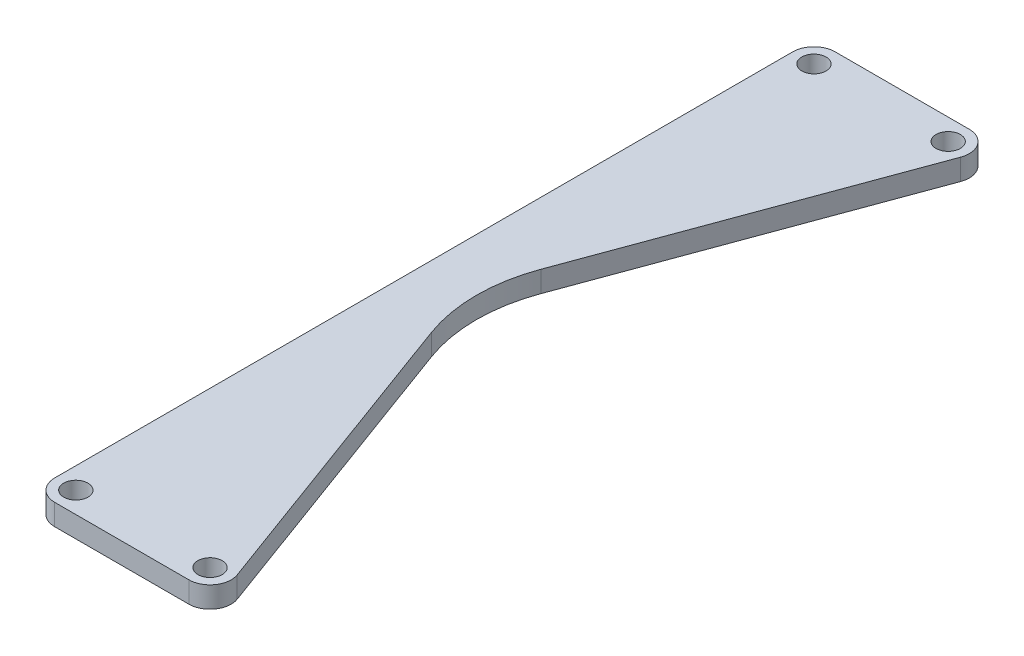
ISO-10303-21;
HEADER;
FILE_DESCRIPTION(('STEP AP214'),'2;1');
FILE_NAME('part.step','',(''),(''),'','','');
FILE_SCHEMA(('AUTOMOTIVE_DESIGN { 1 0 10303 214 1 1 1 1 }'));
ENDSEC;
DATA;
#1=APPLICATION_CONTEXT('core data for automotive mechanical design processes');
#2=APPLICATION_PROTOCOL_DEFINITION('international standard','automotive_design',2000,#1);
#3=PRODUCT_CONTEXT('',#1,'mechanical');
#4=PRODUCT('Part','Part','',(#3));
#5=PRODUCT_RELATED_PRODUCT_CATEGORY('part','',(#4));
#6=PRODUCT_DEFINITION_FORMATION('','',#4);
#7=PRODUCT_DEFINITION_CONTEXT('part definition',#1,'design');
#8=PRODUCT_DEFINITION('design','',#6,#7);
#9=PRODUCT_DEFINITION_SHAPE('','',#8);
#10=(LENGTH_UNIT() NAMED_UNIT(*) SI_UNIT(.MILLI.,.METRE.));
#11=(NAMED_UNIT(*) PLANE_ANGLE_UNIT() SI_UNIT($,.RADIAN.));
#12=(NAMED_UNIT(*) SI_UNIT($,.STERADIAN.) SOLID_ANGLE_UNIT());
#13=UNCERTAINTY_MEASURE_WITH_UNIT(LENGTH_MEASURE(1.E-05),#10,'distance_accuracy_value','');
#14=(GEOMETRIC_REPRESENTATION_CONTEXT(3) GLOBAL_UNCERTAINTY_ASSIGNED_CONTEXT((#13)) GLOBAL_UNIT_ASSIGNED_CONTEXT((#10,
#11,#12)) REPRESENTATION_CONTEXT('',''));
#15=CARTESIAN_POINT('',(0.,0.,0.));
#16=DIRECTION('',(0.,0.,1.));
#17=DIRECTION('',(1.,0.,0.));
#18=AXIS2_PLACEMENT_3D('',#15,#16,#17);
#19=CARTESIAN_POINT('',(25.4,4.,139.7));
#20=DIRECTION('',(0.,1.,0.));
#21=DIRECTION('',(0.,0.,1.));
#22=AXIS2_PLACEMENT_3D('',#19,#20,#21);
#23=PLANE('',#22);
#24=CARTESIAN_POINT('',(25.4,4.,139.7));
#25=DIRECTION('',(0.,1.,0.));
#26=DIRECTION('',(0.,0.,1.));
#27=AXIS2_PLACEMENT_3D('',#24,#25,#26);
#28=CIRCLE('',#27,2.3);
#29=CARTESIAN_POINT('',(25.4,4.,142.));
#30=VERTEX_POINT('',#29);
#31=EDGE_CURVE('E267',#30,#30,#28,.T.);
#32=ORIENTED_EDGE('',*,*,#31,.F.);
#33=EDGE_LOOP('',(#32));
#34=FACE_BOUND('',#33,.T.);
#35=CARTESIAN_POINT('',(0.,4.,0.));
#36=DIRECTION('',(0.,1.,0.));
#37=DIRECTION('',(0.,0.,1.));
#38=AXIS2_PLACEMENT_3D('',#35,#36,#37);
#39=CIRCLE('',#38,2.3);
#40=CARTESIAN_POINT('',(0.,4.,2.3));
#41=VERTEX_POINT('',#40);
#42=EDGE_CURVE('E163',#41,#41,#39,.T.);
#43=ORIENTED_EDGE('',*,*,#42,.F.);
#44=EDGE_LOOP('',(#43));
#45=FACE_BOUND('',#44,.T.);
#46=DIRECTION('',(-1.,0.,0.));
#47=VECTOR('',#46,1.);
#48=CARTESIAN_POINT('',(-4.00000000000002,4.,-4.));
#49=LINE('',#48,#47);
#50=CARTESIAN_POINT('',(25.4,4.,-4.));
#51=VERTEX_POINT('',#50);
#52=CARTESIAN_POINT('',(0.,4.,-4.));
#53=VERTEX_POINT('',#52);
#54=EDGE_CURVE('E143',#51,#53,#49,.T.);
#55=ORIENTED_EDGE('',*,*,#54,.T.);
#56=CARTESIAN_POINT('',(0.,4.,0.));
#57=DIRECTION('',(0.,1.,0.));
#58=DIRECTION('',(0.,0.,1.));
#59=AXIS2_PLACEMENT_3D('',#56,#57,#58);
#60=CIRCLE('',#59,4.);
#61=CARTESIAN_POINT('',(-4.00000000000002,4.,0.));
#62=VERTEX_POINT('',#61);
#63=EDGE_CURVE('E210',#53,#62,#60,.T.);
#64=ORIENTED_EDGE('',*,*,#63,.T.);
#65=DIRECTION('',(0.,0.,1.));
#66=VECTOR('',#65,1.);
#67=CARTESIAN_POINT('',(-3.99999999999999,4.,143.7));
#68=LINE('',#67,#66);
#69=CARTESIAN_POINT('',(-3.99999999999999,4.,139.7));
#70=VERTEX_POINT('',#69);
#71=EDGE_CURVE('E146',#62,#70,#68,.T.);
#72=ORIENTED_EDGE('',*,*,#71,.T.);
#73=CARTESIAN_POINT('',(0.,4.,139.7));
#74=DIRECTION('',(0.,1.,0.));
#75=DIRECTION('',(0.,0.,1.));
#76=AXIS2_PLACEMENT_3D('',#73,#74,#75);
#77=CIRCLE('',#76,4.);
#78=CARTESIAN_POINT('',(0.,4.,143.7));
#79=VERTEX_POINT('',#78);
#80=EDGE_CURVE('E207',#70,#79,#77,.T.);
#81=ORIENTED_EDGE('',*,*,#80,.T.);
#82=DIRECTION('',(1.,0.,0.));
#83=VECTOR('',#82,1.);
#84=CARTESIAN_POINT('',(-3.99999999999999,4.,143.7));
#85=LINE('',#84,#83);
#86=CARTESIAN_POINT('',(25.4,4.,143.7));
#87=VERTEX_POINT('',#86);
#88=EDGE_CURVE('E153',#79,#87,#85,.T.);
#89=ORIENTED_EDGE('',*,*,#88,.T.);
#90=CARTESIAN_POINT('',(25.4,4.,139.7));
#91=DIRECTION('',(0.,1.,0.));
#92=DIRECTION('',(0.,0.,1.));
#93=AXIS2_PLACEMENT_3D('',#90,#91,#92);
#94=CIRCLE('',#93,4.00000000000001);
#95=CARTESIAN_POINT('',(29.154640594373,4.,138.320625501509));
#96=VERTEX_POINT('',#95);
#97=EDGE_CURVE('E156',#87,#96,#94,.T.);
#98=ORIENTED_EDGE('',*,*,#97,.T.);
#99=DIRECTION('',(-0.344843624622696,0.,-0.938660148593239));
#100=VECTOR('',#99,1.);
#101=CARTESIAN_POINT('',(4.00000000000001,4.,69.85));
#102=LINE('',#101,#100);
#103=CARTESIAN_POINT('',(7.80064474733925,4.,80.1953087386809));
#104=VERTEX_POINT('',#103);
#105=EDGE_CURVE('E127',#96,#104,#102,.T.);
#106=ORIENTED_EDGE('',*,*,#105,.T.);
#107=CARTESIAN_POINT('',(35.9604492051364,4.,69.85));
#108=DIRECTION('',(0.,1.,0.));
#109=DIRECTION('',(0.,0.,1.));
#110=AXIS2_PLACEMENT_3D('',#107,#108,#109);
#111=CIRCLE('',#110,30.);
#112=CARTESIAN_POINT('',(7.80064474733925,4.,59.5046912613191));
#113=VERTEX_POINT('',#112);
#114=EDGE_CURVE('E11',#104,#113,#111,.F.);
#115=ORIENTED_EDGE('',*,*,#114,.T.);
#116=DIRECTION('',(0.344843624622696,0.,-0.938660148593239));
#117=VECTOR('',#116,1.);
#118=CARTESIAN_POINT('',(4.00000000000001,4.,69.85));
#119=LINE('',#118,#117);
#120=CARTESIAN_POINT('',(29.154640594373,4.,1.37937449849078));
#121=VERTEX_POINT('',#120);
#122=EDGE_CURVE('E115',#113,#121,#119,.T.);
#123=ORIENTED_EDGE('',*,*,#122,.T.);
#124=CARTESIAN_POINT('',(25.4,4.,0.));
#125=DIRECTION('',(0.,1.,0.));
#126=DIRECTION('',(0.,0.,1.));
#127=AXIS2_PLACEMENT_3D('',#124,#125,#126);
#128=CIRCLE('',#127,4.);
#129=EDGE_CURVE('E120',#121,#51,#128,.T.);
#130=ORIENTED_EDGE('',*,*,#129,.T.);
#131=EDGE_LOOP('',(#55,#64,#72,#81,#89,#98,#106,#115,#123,#130));
#132=FACE_BOUND('',#131,.T.);
#133=CARTESIAN_POINT('',(25.4,4.,0.));
#134=DIRECTION('',(0.,1.,0.));
#135=DIRECTION('',(0.,0.,1.));
#136=AXIS2_PLACEMENT_3D('',#133,#134,#135);
#137=CIRCLE('',#136,2.3);
#138=CARTESIAN_POINT('',(25.4,4.,2.3));
#139=VERTEX_POINT('',#138);
#140=EDGE_CURVE('E259',#139,#139,#137,.T.);
#141=ORIENTED_EDGE('',*,*,#140,.F.);
#142=EDGE_LOOP('',(#141));
#143=FACE_BOUND('',#142,.T.);
#144=CARTESIAN_POINT('',(0.,4.,139.7));
#145=DIRECTION('',(0.,1.,0.));
#146=DIRECTION('',(0.,0.,1.));
#147=AXIS2_PLACEMENT_3D('',#144,#145,#146);
#148=CIRCLE('',#147,2.30000000000137);
#149=CARTESIAN_POINT('',(0.,4.,142.000000000001));
#150=VERTEX_POINT('',#149);
#151=EDGE_CURVE('E275',#150,#150,#148,.T.);
#152=ORIENTED_EDGE('',*,*,#151,.F.);
#153=EDGE_LOOP('',(#152));
#154=FACE_BOUND('',#153,.T.);
#155=ADVANCED_FACE('F38',(#34,#45,#132,#143,#154),#23,.T.);
#156=CARTESIAN_POINT('',(25.4,0.,139.7));
#157=DIRECTION('',(0.,1.,0.));
#158=DIRECTION('',(0.,0.,1.));
#159=AXIS2_PLACEMENT_3D('',#156,#157,#158);
#160=PLANE('',#159);
#161=DIRECTION('',(0.,0.,1.));
#162=VECTOR('',#161,1.);
#163=CARTESIAN_POINT('',(-3.99999999999999,0.,143.7));
#164=LINE('',#163,#162);
#165=CARTESIAN_POINT('',(-4.00000000000002,0.,0.));
#166=VERTEX_POINT('',#165);
#167=CARTESIAN_POINT('',(-3.99999999999999,0.,139.7));
#168=VERTEX_POINT('',#167);
#169=EDGE_CURVE('E173',#166,#168,#164,.T.);
#170=ORIENTED_EDGE('',*,*,#169,.F.);
#171=CARTESIAN_POINT('',(0.,0.,0.));
#172=DIRECTION('',(0.,1.,0.));
#173=DIRECTION('',(0.,0.,1.));
#174=AXIS2_PLACEMENT_3D('',#171,#172,#173);
#175=CIRCLE('',#174,4.);
#176=CARTESIAN_POINT('',(0.,0.,-4.));
#177=VERTEX_POINT('',#176);
#178=EDGE_CURVE('E201',#166,#177,#175,.F.);
#179=ORIENTED_EDGE('',*,*,#178,.T.);
#180=DIRECTION('',(-1.,0.,0.));
#181=VECTOR('',#180,1.);
#182=CARTESIAN_POINT('',(-4.00000000000002,0.,-4.));
#183=LINE('',#182,#181);
#184=CARTESIAN_POINT('',(25.4,0.,-4.));
#185=VERTEX_POINT('',#184);
#186=EDGE_CURVE('E169',#185,#177,#183,.T.);
#187=ORIENTED_EDGE('',*,*,#186,.F.);
#188=CARTESIAN_POINT('',(25.4,0.,0.));
#189=DIRECTION('',(0.,1.,0.));
#190=DIRECTION('',(0.,0.,1.));
#191=AXIS2_PLACEMENT_3D('',#188,#189,#190);
#192=CIRCLE('',#191,4.);
#193=CARTESIAN_POINT('',(29.154640594373,0.,1.37937449849078));
#194=VERTEX_POINT('',#193);
#195=EDGE_CURVE('E166',#194,#185,#192,.T.);
#196=ORIENTED_EDGE('',*,*,#195,.F.);
#197=DIRECTION('',(0.344843624622696,0.,-0.938660148593239));
#198=VECTOR('',#197,1.);
#199=CARTESIAN_POINT('',(4.00000000000001,0.,69.85));
#200=LINE('',#199,#198);
#201=CARTESIAN_POINT('',(7.80064474733925,0.,59.5046912613191));
#202=VERTEX_POINT('',#201);
#203=EDGE_CURVE('E132',#202,#194,#200,.T.);
#204=ORIENTED_EDGE('',*,*,#203,.F.);
#205=CARTESIAN_POINT('',(35.9604492051364,0.,69.85));
#206=DIRECTION('',(0.,1.,0.));
#207=DIRECTION('',(0.,0.,1.));
#208=AXIS2_PLACEMENT_3D('',#205,#206,#207);
#209=CIRCLE('',#208,30.);
#210=CARTESIAN_POINT('',(7.80064474733925,0.,80.1953087386809));
#211=VERTEX_POINT('',#210);
#212=EDGE_CURVE('E47',#202,#211,#209,.T.);
#213=ORIENTED_EDGE('',*,*,#212,.T.);
#214=DIRECTION('',(-0.344843624622696,0.,-0.938660148593239));
#215=VECTOR('',#214,1.);
#216=CARTESIAN_POINT('',(4.00000000000001,0.,69.85));
#217=LINE('',#216,#215);
#218=CARTESIAN_POINT('',(29.154640594373,0.,138.320625501509));
#219=VERTEX_POINT('',#218);
#220=EDGE_CURVE('E160',#219,#211,#217,.T.);
#221=ORIENTED_EDGE('',*,*,#220,.F.);
#222=CARTESIAN_POINT('',(25.4,0.,139.7));
#223=DIRECTION('',(0.,1.,0.));
#224=DIRECTION('',(0.,0.,1.));
#225=AXIS2_PLACEMENT_3D('',#222,#223,#224);
#226=CIRCLE('',#225,4.00000000000001);
#227=CARTESIAN_POINT('',(25.4,0.,143.7));
#228=VERTEX_POINT('',#227);
#229=EDGE_CURVE('E180',#228,#219,#226,.T.);
#230=ORIENTED_EDGE('',*,*,#229,.F.);
#231=DIRECTION('',(1.,0.,0.));
#232=VECTOR('',#231,1.);
#233=CARTESIAN_POINT('',(-3.99999999999999,0.,143.7));
#234=LINE('',#233,#232);
#235=CARTESIAN_POINT('',(0.,0.,143.7));
#236=VERTEX_POINT('',#235);
#237=EDGE_CURVE('E177',#236,#228,#234,.T.);
#238=ORIENTED_EDGE('',*,*,#237,.F.);
#239=CARTESIAN_POINT('',(0.,0.,139.7));
#240=DIRECTION('',(0.,1.,0.));
#241=DIRECTION('',(0.,0.,1.));
#242=AXIS2_PLACEMENT_3D('',#239,#240,#241);
#243=CIRCLE('',#242,4.);
#244=EDGE_CURVE('E198',#236,#168,#243,.F.);
#245=ORIENTED_EDGE('',*,*,#244,.T.);
#246=EDGE_LOOP('',(#170,#179,#187,#196,#204,#213,#221,#230,#238,#245));
#247=FACE_BOUND('',#246,.T.);
#248=CARTESIAN_POINT('',(0.,0.,0.));
#249=DIRECTION('',(0.,1.,0.));
#250=DIRECTION('',(0.,0.,1.));
#251=AXIS2_PLACEMENT_3D('',#248,#249,#250);
#252=CIRCLE('',#251,2.3);
#253=CARTESIAN_POINT('',(0.,0.,2.3));
#254=VERTEX_POINT('',#253);
#255=EDGE_CURVE('E255',#254,#254,#252,.T.);
#256=ORIENTED_EDGE('',*,*,#255,.T.);
#257=EDGE_LOOP('',(#256));
#258=FACE_BOUND('',#257,.T.);
#259=CARTESIAN_POINT('',(25.4,0.,0.));
#260=DIRECTION('',(0.,1.,0.));
#261=DIRECTION('',(0.,0.,1.));
#262=AXIS2_PLACEMENT_3D('',#259,#260,#261);
#263=CIRCLE('',#262,2.3);
#264=CARTESIAN_POINT('',(25.4,0.,2.3));
#265=VERTEX_POINT('',#264);
#266=EDGE_CURVE('E263',#265,#265,#263,.T.);
#267=ORIENTED_EDGE('',*,*,#266,.T.);
#268=EDGE_LOOP('',(#267));
#269=FACE_BOUND('',#268,.T.);
#270=CARTESIAN_POINT('',(25.4,0.,139.7));
#271=DIRECTION('',(0.,1.,0.));
#272=DIRECTION('',(0.,0.,1.));
#273=AXIS2_PLACEMENT_3D('',#270,#271,#272);
#274=CIRCLE('',#273,2.3);
#275=CARTESIAN_POINT('',(25.4,0.,142.));
#276=VERTEX_POINT('',#275);
#277=EDGE_CURVE('E271',#276,#276,#274,.T.);
#278=ORIENTED_EDGE('',*,*,#277,.T.);
#279=EDGE_LOOP('',(#278));
#280=FACE_BOUND('',#279,.T.);
#281=CARTESIAN_POINT('',(0.,0.,139.7));
#282=DIRECTION('',(0.,1.,0.));
#283=DIRECTION('',(0.,0.,1.));
#284=AXIS2_PLACEMENT_3D('',#281,#282,#283);
#285=CIRCLE('',#284,2.30000000000137);
#286=CARTESIAN_POINT('',(0.,0.,142.000000000001));
#287=VERTEX_POINT('',#286);
#288=EDGE_CURVE('E279',#287,#287,#285,.T.);
#289=ORIENTED_EDGE('',*,*,#288,.T.);
#290=EDGE_LOOP('',(#289));
#291=FACE_BOUND('',#290,.T.);
#292=ADVANCED_FACE('F224',(#247,#258,#269,#280,#291),#160,.F.);
#293=CARTESIAN_POINT('',(4.00000000000001,4.,69.85));
#294=DIRECTION('',(-0.938660148593239,0.,0.344843624622696));
#295=DIRECTION('',(0.344843624622696,0.,0.938660148593239));
#296=AXIS2_PLACEMENT_3D('',#293,#294,#295);
#297=PLANE('',#296);
#298=ORIENTED_EDGE('',*,*,#220,.T.);
#299=DIRECTION('',(0.,-1.,0.));
#300=VECTOR('',#299,1.);
#301=CARTESIAN_POINT('',(7.80064474733926,4.,80.1953087386809));
#302=LINE('',#301,#300);
#303=EDGE_CURVE('E54',#211,#104,#302,.F.);
#304=ORIENTED_EDGE('',*,*,#303,.T.);
#305=ORIENTED_EDGE('',*,*,#105,.F.);
#306=DIRECTION('',(0.,-1.,0.));
#307=VECTOR('',#306,1.);
#308=CARTESIAN_POINT('',(29.154640594373,4.,138.320625501509));
#309=LINE('',#308,#307);
#310=EDGE_CURVE('E159',#96,#219,#309,.T.);
#311=ORIENTED_EDGE('',*,*,#310,.T.);
#312=EDGE_LOOP('',(#298,#304,#305,#311));
#313=FACE_BOUND('',#312,.T.);
#314=ADVANCED_FACE('F252',(#313),#297,.F.);
#315=CARTESIAN_POINT('',(4.00000000000001,4.,69.85));
#316=DIRECTION('',(-0.938660148593239,0.,-0.344843624622696));
#317=DIRECTION('',(-0.344843624622696,0.,0.938660148593239));
#318=AXIS2_PLACEMENT_3D('',#315,#316,#317);
#319=PLANE('',#318);
#320=ORIENTED_EDGE('',*,*,#122,.F.);
#321=DIRECTION('',(0.,-1.,0.));
#322=VECTOR('',#321,1.);
#323=CARTESIAN_POINT('',(7.80064474733924,0.,59.5046912613191));
#324=LINE('',#323,#322);
#325=EDGE_CURVE('E217',#113,#202,#324,.T.);
#326=ORIENTED_EDGE('',*,*,#325,.T.);
#327=ORIENTED_EDGE('',*,*,#203,.T.);
#328=DIRECTION('',(0.,-1.,0.));
#329=VECTOR('',#328,1.);
#330=CARTESIAN_POINT('',(29.154640594373,4.,1.37937449849078));
#331=LINE('',#330,#329);
#332=EDGE_CURVE('E130',#121,#194,#331,.T.);
#333=ORIENTED_EDGE('',*,*,#332,.F.);
#334=EDGE_LOOP('',(#320,#326,#327,#333));
#335=FACE_BOUND('',#334,.T.);
#336=ADVANCED_FACE('F131',(#335),#319,.F.);
#337=CARTESIAN_POINT('',(25.4,4.,0.));
#338=DIRECTION('',(0.,-1.,0.));
#339=DIRECTION('',(0.,0.,-1.));
#340=AXIS2_PLACEMENT_3D('',#337,#338,#339);
#341=CYLINDRICAL_SURFACE('',#340,4.);
#342=ORIENTED_EDGE('',*,*,#195,.T.);
#343=DIRECTION('',(0.,-1.,0.));
#344=VECTOR('',#343,1.);
#345=CARTESIAN_POINT('',(25.4,4.,-4.));
#346=LINE('',#345,#344);
#347=EDGE_CURVE('E137',#51,#185,#346,.T.);
#348=ORIENTED_EDGE('',*,*,#347,.F.);
#349=ORIENTED_EDGE('',*,*,#129,.F.);
#350=ORIENTED_EDGE('',*,*,#332,.T.);
#351=EDGE_LOOP('',(#342,#348,#349,#350));
#352=FACE_BOUND('',#351,.T.);
#353=ADVANCED_FACE('F139',(#352),#341,.T.);
#354=CARTESIAN_POINT('',(-4.00000000000002,4.,-4.));
#355=DIRECTION('',(0.,0.,1.));
#356=DIRECTION('',(1.,0.,0.));
#357=AXIS2_PLACEMENT_3D('',#354,#355,#356);
#358=PLANE('',#357);
#359=ORIENTED_EDGE('',*,*,#186,.T.);
#360=DIRECTION('',(0.,-1.,0.));
#361=VECTOR('',#360,1.);
#362=CARTESIAN_POINT('',(0.,4.,-4.));
#363=LINE('',#362,#361);
#364=EDGE_CURVE('E204',#177,#53,#363,.F.);
#365=ORIENTED_EDGE('',*,*,#364,.T.);
#366=ORIENTED_EDGE('',*,*,#54,.F.);
#367=ORIENTED_EDGE('',*,*,#347,.T.);
#368=EDGE_LOOP('',(#359,#365,#366,#367));
#369=FACE_BOUND('',#368,.T.);
#370=ADVANCED_FACE('F228',(#369),#358,.F.);
#371=CARTESIAN_POINT('',(-3.99999999999999,4.,143.7));
#372=DIRECTION('',(1.,0.,0.));
#373=DIRECTION('',(0.,0.,-1.));
#374=AXIS2_PLACEMENT_3D('',#371,#372,#373);
#375=PLANE('',#374);
#376=ORIENTED_EDGE('',*,*,#71,.F.);
#377=DIRECTION('',(0.,-1.,0.));
#378=VECTOR('',#377,1.);
#379=CARTESIAN_POINT('',(-4.00000000000002,4.,0.));
#380=LINE('',#379,#378);
#381=EDGE_CURVE('E194',#62,#166,#380,.T.);
#382=ORIENTED_EDGE('',*,*,#381,.T.);
#383=ORIENTED_EDGE('',*,*,#169,.T.);
#384=DIRECTION('',(0.,-1.,0.));
#385=VECTOR('',#384,1.);
#386=CARTESIAN_POINT('',(-3.99999999999999,4.,139.7));
#387=LINE('',#386,#385);
#388=EDGE_CURVE('E136',#168,#70,#387,.F.);
#389=ORIENTED_EDGE('',*,*,#388,.T.);
#390=EDGE_LOOP('',(#376,#382,#383,#389));
#391=FACE_BOUND('',#390,.T.);
#392=ADVANCED_FACE('F236',(#391),#375,.F.);
#393=CARTESIAN_POINT('',(-3.99999999999999,4.,143.7));
#394=DIRECTION('',(0.,0.,-1.));
#395=DIRECTION('',(-1.,0.,0.));
#396=AXIS2_PLACEMENT_3D('',#393,#394,#395);
#397=PLANE('',#396);
#398=ORIENTED_EDGE('',*,*,#88,.F.);
#399=DIRECTION('',(0.,-1.,0.));
#400=VECTOR('',#399,1.);
#401=CARTESIAN_POINT('',(0.,4.,143.7));
#402=LINE('',#401,#400);
#403=EDGE_CURVE('E213',#79,#236,#402,.T.);
#404=ORIENTED_EDGE('',*,*,#403,.T.);
#405=ORIENTED_EDGE('',*,*,#237,.T.);
#406=DIRECTION('',(0.,-1.,0.));
#407=VECTOR('',#406,1.);
#408=CARTESIAN_POINT('',(25.4,4.,143.7));
#409=LINE('',#408,#407);
#410=EDGE_CURVE('E186',#87,#228,#409,.T.);
#411=ORIENTED_EDGE('',*,*,#410,.F.);
#412=EDGE_LOOP('',(#398,#404,#405,#411));
#413=FACE_BOUND('',#412,.T.);
#414=ADVANCED_FACE('F246',(#413),#397,.F.);
#415=CARTESIAN_POINT('',(25.4,4.,139.7));
#416=DIRECTION('',(0.,-1.,0.));
#417=DIRECTION('',(0.,0.,-1.));
#418=AXIS2_PLACEMENT_3D('',#415,#416,#417);
#419=CYLINDRICAL_SURFACE('',#418,4.00000000000001);
#420=ORIENTED_EDGE('',*,*,#229,.T.);
#421=ORIENTED_EDGE('',*,*,#310,.F.);
#422=ORIENTED_EDGE('',*,*,#97,.F.);
#423=ORIENTED_EDGE('',*,*,#410,.T.);
#424=EDGE_LOOP('',(#420,#421,#422,#423));
#425=FACE_BOUND('',#424,.T.);
#426=ADVANCED_FACE('F251',(#425),#419,.T.);
#427=CARTESIAN_POINT('',(0.,4.,0.));
#428=DIRECTION('',(0.,-1.,0.));
#429=DIRECTION('',(0.,0.,-1.));
#430=AXIS2_PLACEMENT_3D('',#427,#428,#429);
#431=CYLINDRICAL_SURFACE('',#430,2.3);
#432=ORIENTED_EDGE('',*,*,#42,.T.);
#433=EDGE_LOOP('',(#432));
#434=FACE_BOUND('',#433,.T.);
#435=ORIENTED_EDGE('',*,*,#255,.F.);
#436=EDGE_LOOP('',(#435));
#437=FACE_BOUND('',#436,.T.);
#438=ADVANCED_FACE('F301',(#434,#437),#431,.F.);
#439=CARTESIAN_POINT('',(25.4,4.,0.));
#440=DIRECTION('',(0.,-1.,0.));
#441=DIRECTION('',(0.,0.,-1.));
#442=AXIS2_PLACEMENT_3D('',#439,#440,#441);
#443=CYLINDRICAL_SURFACE('',#442,2.3);
#444=ORIENTED_EDGE('',*,*,#140,.T.);
#445=EDGE_LOOP('',(#444));
#446=FACE_BOUND('',#445,.T.);
#447=ORIENTED_EDGE('',*,*,#266,.F.);
#448=EDGE_LOOP('',(#447));
#449=FACE_BOUND('',#448,.T.);
#450=ADVANCED_FACE('F382',(#446,#449),#443,.F.);
#451=CARTESIAN_POINT('',(25.4,4.,139.7));
#452=DIRECTION('',(0.,-1.,0.));
#453=DIRECTION('',(0.,0.,-1.));
#454=AXIS2_PLACEMENT_3D('',#451,#452,#453);
#455=CYLINDRICAL_SURFACE('',#454,2.3);
#456=ORIENTED_EDGE('',*,*,#31,.T.);
#457=EDGE_LOOP('',(#456));
#458=FACE_BOUND('',#457,.T.);
#459=ORIENTED_EDGE('',*,*,#277,.F.);
#460=EDGE_LOOP('',(#459));
#461=FACE_BOUND('',#460,.T.);
#462=ADVANCED_FACE('F390',(#458,#461),#455,.F.);
#463=CARTESIAN_POINT('',(0.,4.,139.7));
#464=DIRECTION('',(0.,-1.,0.));
#465=DIRECTION('',(0.,0.,-1.));
#466=AXIS2_PLACEMENT_3D('',#463,#464,#465);
#467=CYLINDRICAL_SURFACE('',#466,2.30000000000137);
#468=ORIENTED_EDGE('',*,*,#151,.T.);
#469=EDGE_LOOP('',(#468));
#470=FACE_BOUND('',#469,.T.);
#471=ORIENTED_EDGE('',*,*,#288,.F.);
#472=EDGE_LOOP('',(#471));
#473=FACE_BOUND('',#472,.T.);
#474=ADVANCED_FACE('F287',(#470,#473),#467,.F.);
#475=CARTESIAN_POINT('',(0.,4.,0.));
#476=DIRECTION('',(0.,-1.,0.));
#477=DIRECTION('',(0.,0.,-1.));
#478=AXIS2_PLACEMENT_3D('',#475,#476,#477);
#479=CYLINDRICAL_SURFACE('',#478,4.);
#480=ORIENTED_EDGE('',*,*,#63,.F.);
#481=ORIENTED_EDGE('',*,*,#364,.F.);
#482=ORIENTED_EDGE('',*,*,#178,.F.);
#483=ORIENTED_EDGE('',*,*,#381,.F.);
#484=EDGE_LOOP('',(#480,#481,#482,#483));
#485=FACE_BOUND('',#484,.T.);
#486=ADVANCED_FACE('F234',(#485),#479,.T.);
#487=CARTESIAN_POINT('',(0.,4.,139.7));
#488=DIRECTION('',(0.,-1.,0.));
#489=DIRECTION('',(0.,0.,-1.));
#490=AXIS2_PLACEMENT_3D('',#487,#488,#489);
#491=CYLINDRICAL_SURFACE('',#490,4.);
#492=ORIENTED_EDGE('',*,*,#80,.F.);
#493=ORIENTED_EDGE('',*,*,#388,.F.);
#494=ORIENTED_EDGE('',*,*,#244,.F.);
#495=ORIENTED_EDGE('',*,*,#403,.F.);
#496=EDGE_LOOP('',(#492,#493,#494,#495));
#497=FACE_BOUND('',#496,.T.);
#498=ADVANCED_FACE('F243',(#497),#491,.T.);
#499=CARTESIAN_POINT('',(35.9604492051364,4.,69.85));
#500=DIRECTION('',(0.,1.,0.));
#501=DIRECTION('',(0.,0.,1.));
#502=AXIS2_PLACEMENT_3D('',#499,#500,#501);
#503=CYLINDRICAL_SURFACE('',#502,30.);
#504=ORIENTED_EDGE('',*,*,#114,.F.);
#505=ORIENTED_EDGE('',*,*,#303,.F.);
#506=ORIENTED_EDGE('',*,*,#212,.F.);
#507=ORIENTED_EDGE('',*,*,#325,.F.);
#508=EDGE_LOOP('',(#504,#505,#506,#507));
#509=FACE_BOUND('',#508,.T.);
#510=ADVANCED_FACE('F40',(#509),#503,.F.);
#511=CLOSED_SHELL('',(#155,#292,#314,#336,#353,#370,#392,#414,#426,#438,#450,#462,#474,#486,
#498,#510));
#512=MANIFOLD_SOLID_BREP('B2',#511);
#513=ADVANCED_BREP_SHAPE_REPRESENTATION('',(#18,#512),#14);
#514=SHAPE_DEFINITION_REPRESENTATION(#9,#513);
ENDSEC;
END-ISO-10303-21;
